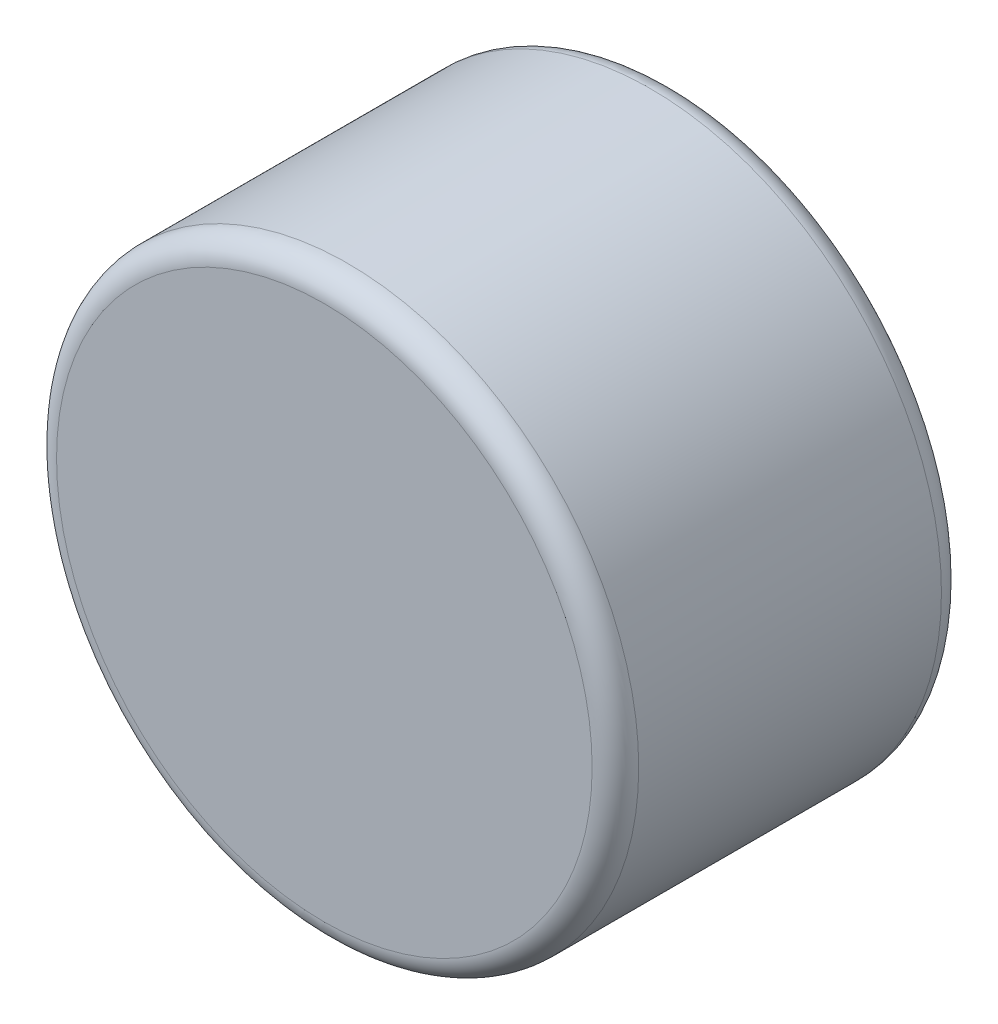
ISO-10303-21;
HEADER;
FILE_DESCRIPTION(('STEP AP214'),'2;1');
FILE_NAME('part.step','',(''),(''),'','','');
FILE_SCHEMA(('AUTOMOTIVE_DESIGN { 1 0 10303 214 1 1 1 1 }'));
ENDSEC;
DATA;
#1=APPLICATION_CONTEXT('core data for automotive mechanical design processes');
#2=APPLICATION_PROTOCOL_DEFINITION('international standard','automotive_design',2000,#1);
#3=PRODUCT_CONTEXT('',#1,'mechanical');
#4=PRODUCT('Part','Part','',(#3));
#5=PRODUCT_RELATED_PRODUCT_CATEGORY('part','',(#4));
#6=PRODUCT_DEFINITION_FORMATION('','',#4);
#7=PRODUCT_DEFINITION_CONTEXT('part definition',#1,'design');
#8=PRODUCT_DEFINITION('design','',#6,#7);
#9=PRODUCT_DEFINITION_SHAPE('','',#8);
#10=(LENGTH_UNIT() NAMED_UNIT(*) SI_UNIT(.MILLI.,.METRE.));
#11=(NAMED_UNIT(*) PLANE_ANGLE_UNIT() SI_UNIT($,.RADIAN.));
#12=(NAMED_UNIT(*) SI_UNIT($,.STERADIAN.) SOLID_ANGLE_UNIT());
#13=UNCERTAINTY_MEASURE_WITH_UNIT(LENGTH_MEASURE(1.E-05),#10,'distance_accuracy_value','');
#14=(GEOMETRIC_REPRESENTATION_CONTEXT(3) GLOBAL_UNCERTAINTY_ASSIGNED_CONTEXT((#13)) GLOBAL_UNIT_ASSIGNED_CONTEXT((#10,
#11,#12)) REPRESENTATION_CONTEXT('',''));
#15=CARTESIAN_POINT('',(0.,0.,0.));
#16=DIRECTION('',(0.,0.,1.));
#17=DIRECTION('',(1.,0.,0.));
#18=AXIS2_PLACEMENT_3D('',#15,#16,#17);
#19=CARTESIAN_POINT('',(0.,0.,3.));
#20=DIRECTION('',(0.,0.,-1.));
#21=DIRECTION('',(-1.,0.,0.));
#22=AXIS2_PLACEMENT_3D('',#19,#20,#21);
#23=CYLINDRICAL_SURFACE('',#22,2.5);
#24=CARTESIAN_POINT('',(0.,0.,2.8));
#25=DIRECTION('',(0.,0.,1.));
#26=DIRECTION('',(1.,0.,0.));
#27=AXIS2_PLACEMENT_3D('',#24,#25,#26);
#28=CIRCLE('',#27,2.5);
#29=CARTESIAN_POINT('',(2.5,0.,2.8));
#30=VERTEX_POINT('',#29);
#31=EDGE_CURVE('E42',#30,#30,#28,.F.);
#32=ORIENTED_EDGE('',*,*,#31,.T.);
#33=EDGE_LOOP('',(#32));
#34=FACE_BOUND('',#33,.T.);
#35=CARTESIAN_POINT('',(0.,0.,0.2));
#36=DIRECTION('',(0.,0.,1.));
#37=DIRECTION('',(1.,0.,0.));
#38=AXIS2_PLACEMENT_3D('',#35,#36,#37);
#39=CIRCLE('',#38,2.5);
#40=CARTESIAN_POINT('',(2.5,0.,0.2));
#41=VERTEX_POINT('',#40);
#42=EDGE_CURVE('E46',#41,#41,#39,.T.);
#43=ORIENTED_EDGE('',*,*,#42,.T.);
#44=EDGE_LOOP('',(#43));
#45=FACE_BOUND('',#44,.T.);
#46=ADVANCED_FACE('F35',(#34,#45),#23,.T.);
#47=CARTESIAN_POINT('',(0.,0.,3.));
#48=DIRECTION('',(0.,0.,1.));
#49=DIRECTION('',(1.,0.,0.));
#50=AXIS2_PLACEMENT_3D('',#47,#48,#49);
#51=PLANE('',#50);
#52=CARTESIAN_POINT('',(0.,0.,3.));
#53=DIRECTION('',(0.,0.,1.));
#54=DIRECTION('',(1.,0.,0.));
#55=AXIS2_PLACEMENT_3D('',#52,#53,#54);
#56=CIRCLE('',#55,2.3);
#57=CARTESIAN_POINT('',(2.3,0.,3.));
#58=VERTEX_POINT('',#57);
#59=EDGE_CURVE('E50',#58,#58,#56,.T.);
#60=ORIENTED_EDGE('',*,*,#59,.T.);
#61=EDGE_LOOP('',(#60));
#62=FACE_BOUND('',#61,.T.);
#63=ADVANCED_FACE('F56',(#62),#51,.T.);
#64=CARTESIAN_POINT('',(0.,0.,0.));
#65=DIRECTION('',(0.,0.,1.));
#66=DIRECTION('',(1.,0.,0.));
#67=AXIS2_PLACEMENT_3D('',#64,#65,#66);
#68=PLANE('',#67);
#69=CARTESIAN_POINT('',(0.,0.,0.));
#70=DIRECTION('',(0.,0.,1.));
#71=DIRECTION('',(1.,0.,0.));
#72=AXIS2_PLACEMENT_3D('',#69,#70,#71);
#73=CIRCLE('',#72,2.3);
#74=CARTESIAN_POINT('',(2.3,0.,0.));
#75=VERTEX_POINT('',#74);
#76=EDGE_CURVE('E10',#75,#75,#73,.F.);
#77=ORIENTED_EDGE('',*,*,#76,.T.);
#78=EDGE_LOOP('',(#77));
#79=FACE_BOUND('',#78,.T.);
#80=ADVANCED_FACE('F60',(#79),#68,.F.);
#81=CARTESIAN_POINT('',(0.,0.,2.8));
#82=DIRECTION('',(0.,0.,1.));
#83=DIRECTION('',(1.,0.,0.));
#84=AXIS2_PLACEMENT_3D('',#81,#82,#83);
#85=TOROIDAL_SURFACE('',#84,2.3,0.2);
#86=ORIENTED_EDGE('',*,*,#31,.F.);
#87=EDGE_LOOP('',(#86));
#88=FACE_BOUND('',#87,.T.);
#89=ORIENTED_EDGE('',*,*,#59,.F.);
#90=EDGE_LOOP('',(#89));
#91=FACE_BOUND('',#90,.T.);
#92=ADVANCED_FACE('F58',(#88,#91),#85,.T.);
#93=CARTESIAN_POINT('',(0.,0.,0.2));
#94=DIRECTION('',(0.,0.,1.));
#95=DIRECTION('',(1.,0.,0.));
#96=AXIS2_PLACEMENT_3D('',#93,#94,#95);
#97=TOROIDAL_SURFACE('',#96,2.3,0.2);
#98=ORIENTED_EDGE('',*,*,#76,.F.);
#99=EDGE_LOOP('',(#98));
#100=FACE_BOUND('',#99,.T.);
#101=ORIENTED_EDGE('',*,*,#42,.F.);
#102=EDGE_LOOP('',(#101));
#103=FACE_BOUND('',#102,.T.);
#104=ADVANCED_FACE('F37',(#100,#103),#97,.T.);
#105=CLOSED_SHELL('',(#46,#63,#80,#92,#104));
#106=MANIFOLD_SOLID_BREP('B2',#105);
#107=ADVANCED_BREP_SHAPE_REPRESENTATION('',(#18,#106),#14);
#108=SHAPE_DEFINITION_REPRESENTATION(#9,#107);
ENDSEC;
END-ISO-10303-21;
